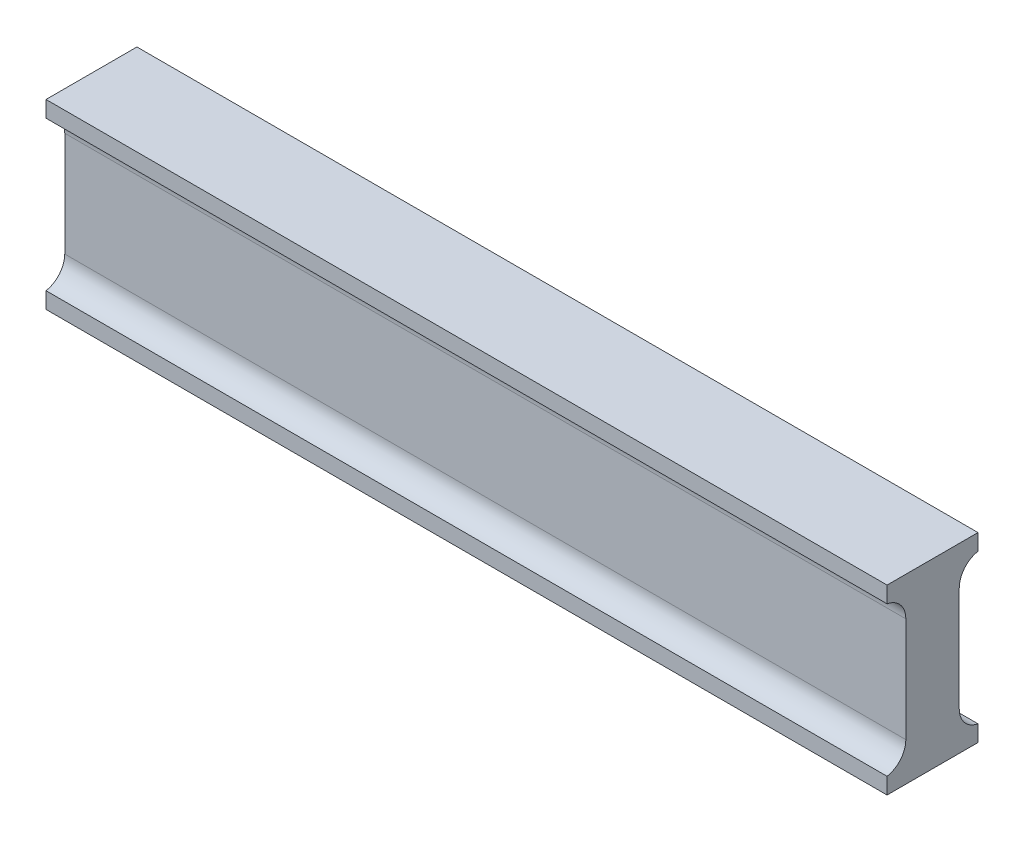
ISO-10303-21;
HEADER;
FILE_DESCRIPTION(('STEP AP214'),'2;1');
FILE_NAME('part.step','',(''),(''),'','','');
FILE_SCHEMA(('AUTOMOTIVE_DESIGN { 1 0 10303 214 1 1 1 1 }'));
ENDSEC;
DATA;
#1=APPLICATION_CONTEXT('core data for automotive mechanical design processes');
#2=APPLICATION_PROTOCOL_DEFINITION('international standard','automotive_design',2000,#1);
#3=PRODUCT_CONTEXT('',#1,'mechanical');
#4=PRODUCT('Part','Part','',(#3));
#5=PRODUCT_RELATED_PRODUCT_CATEGORY('part','',(#4));
#6=PRODUCT_DEFINITION_FORMATION('','',#4);
#7=PRODUCT_DEFINITION_CONTEXT('part definition',#1,'design');
#8=PRODUCT_DEFINITION('design','',#6,#7);
#9=PRODUCT_DEFINITION_SHAPE('','',#8);
#10=(LENGTH_UNIT() NAMED_UNIT(*) SI_UNIT(.MILLI.,.METRE.));
#11=(NAMED_UNIT(*) PLANE_ANGLE_UNIT() SI_UNIT($,.RADIAN.));
#12=(NAMED_UNIT(*) SI_UNIT($,.STERADIAN.) SOLID_ANGLE_UNIT());
#13=UNCERTAINTY_MEASURE_WITH_UNIT(LENGTH_MEASURE(1.E-05),#10,'distance_accuracy_value','');
#14=(GEOMETRIC_REPRESENTATION_CONTEXT(3) GLOBAL_UNCERTAINTY_ASSIGNED_CONTEXT((#13)) GLOBAL_UNIT_ASSIGNED_CONTEXT((#10,
#11,#12)) REPRESENTATION_CONTEXT('',''));
#15=CARTESIAN_POINT('',(0.,0.,0.));
#16=DIRECTION('',(0.,0.,1.));
#17=DIRECTION('',(1.,0.,0.));
#18=AXIS2_PLACEMENT_3D('',#15,#16,#17);
#19=CARTESIAN_POINT('',(0.,0.,20.));
#20=DIRECTION('',(0.,0.,-1.));
#21=DIRECTION('',(-1.,0.,0.));
#22=AXIS2_PLACEMENT_3D('',#19,#20,#21);
#23=PLANE('',#22);
#24=DIRECTION('',(0.,-1.,0.));
#25=VECTOR('',#24,1.);
#26=CARTESIAN_POINT('',(-92.5,-20.,20.));
#27=LINE('',#26,#25);
#28=CARTESIAN_POINT('',(-92.5,20.,20.));
#29=VERTEX_POINT('',#28);
#30=CARTESIAN_POINT('',(-92.5,16.4270123065396,20.));
#31=VERTEX_POINT('',#30);
#32=EDGE_CURVE('E194',#29,#31,#27,.T.);
#33=ORIENTED_EDGE('',*,*,#32,.T.);
#34=DIRECTION('',(1.,0.,0.));
#35=VECTOR('',#34,1.);
#36=CARTESIAN_POINT('',(0.,16.4270123065396,20.));
#37=LINE('',#36,#35);
#38=CARTESIAN_POINT('',(92.5,16.4270123065396,20.));
#39=VERTEX_POINT('',#38);
#40=EDGE_CURVE('E156',#31,#39,#37,.T.);
#41=ORIENTED_EDGE('',*,*,#40,.T.);
#42=DIRECTION('',(0.,1.,0.));
#43=VECTOR('',#42,1.);
#44=CARTESIAN_POINT('',(92.5,-20.,20.));
#45=LINE('',#44,#43);
#46=CARTESIAN_POINT('',(92.5,20.,20.));
#47=VERTEX_POINT('',#46);
#48=EDGE_CURVE('E182',#39,#47,#45,.T.);
#49=ORIENTED_EDGE('',*,*,#48,.T.);
#50=DIRECTION('',(-1.,0.,0.));
#51=VECTOR('',#50,1.);
#52=CARTESIAN_POINT('',(-92.5,20.,20.));
#53=LINE('',#52,#51);
#54=EDGE_CURVE('E197',#47,#29,#53,.T.);
#55=ORIENTED_EDGE('',*,*,#54,.T.);
#56=EDGE_LOOP('',(#33,#41,#49,#55));
#57=FACE_BOUND('',#56,.T.);
#58=ADVANCED_FACE('F37',(#57),#23,.F.);
#59=CARTESIAN_POINT('',(0.,0.,0.));
#60=DIRECTION('',(0.,0.,-1.));
#61=DIRECTION('',(-1.,0.,0.));
#62=AXIS2_PLACEMENT_3D('',#59,#60,#61);
#63=PLANE('',#62);
#64=DIRECTION('',(1.,0.,0.));
#65=VECTOR('',#64,1.);
#66=CARTESIAN_POINT('',(0.,16.4270123065396,0.));
#67=LINE('',#66,#65);
#68=CARTESIAN_POINT('',(-92.5,16.4270123065396,0.));
#69=VERTEX_POINT('',#68);
#70=CARTESIAN_POINT('',(92.5,16.4270123065396,0.));
#71=VERTEX_POINT('',#70);
#72=EDGE_CURVE('E144',#69,#71,#67,.T.);
#73=ORIENTED_EDGE('',*,*,#72,.F.);
#74=DIRECTION('',(0.,-1.,0.));
#75=VECTOR('',#74,1.);
#76=CARTESIAN_POINT('',(-92.5,-20.,0.));
#77=LINE('',#76,#75);
#78=CARTESIAN_POINT('',(-92.5,20.,0.));
#79=VERTEX_POINT('',#78);
#80=EDGE_CURVE('E210',#79,#69,#77,.T.);
#81=ORIENTED_EDGE('',*,*,#80,.F.);
#82=DIRECTION('',(-1.,0.,0.));
#83=VECTOR('',#82,1.);
#84=CARTESIAN_POINT('',(-92.5,20.,0.));
#85=LINE('',#84,#83);
#86=CARTESIAN_POINT('',(92.5,20.,0.));
#87=VERTEX_POINT('',#86);
#88=EDGE_CURVE('E146',#87,#79,#85,.T.);
#89=ORIENTED_EDGE('',*,*,#88,.F.);
#90=DIRECTION('',(0.,1.,0.));
#91=VECTOR('',#90,1.);
#92=CARTESIAN_POINT('',(92.5,-20.,0.));
#93=LINE('',#92,#91);
#94=EDGE_CURVE('E130',#71,#87,#93,.T.);
#95=ORIENTED_EDGE('',*,*,#94,.F.);
#96=EDGE_LOOP('',(#73,#81,#89,#95));
#97=FACE_BOUND('',#96,.T.);
#98=ADVANCED_FACE('F142',(#97),#63,.T.);
#99=CARTESIAN_POINT('',(92.5,-20.,20.));
#100=DIRECTION('',(-1.,0.,0.));
#101=DIRECTION('',(0.,0.,1.));
#102=AXIS2_PLACEMENT_3D('',#99,#100,#101);
#103=PLANE('',#102);
#104=DIRECTION('',(0.,-1.,0.));
#105=VECTOR('',#104,1.);
#106=CARTESIAN_POINT('',(92.5,-16.4270123065396,4.12501901528166));
#107=LINE('',#106,#105);
#108=CARTESIAN_POINT('',(92.5,11.5041667598683,4.12501901528166));
#109=VERTEX_POINT('',#108);
#110=CARTESIAN_POINT('',(92.5,-11.5041667598683,4.12501901528166));
#111=VERTEX_POINT('',#110);
#112=EDGE_CURVE('E133',#109,#111,#107,.T.);
#113=ORIENTED_EDGE('',*,*,#112,.F.);
#114=CARTESIAN_POINT('',(92.5,11.5041667598683,-0.874980984718343));
#115=DIRECTION('',(-1.,0.,0.));
#116=DIRECTION('',(0.,0.,1.));
#117=AXIS2_PLACEMENT_3D('',#114,#115,#116);
#118=CIRCLE('',#117,5.);
#119=EDGE_CURVE('E126',#109,#71,#118,.T.);
#120=ORIENTED_EDGE('',*,*,#119,.T.);
#121=ORIENTED_EDGE('',*,*,#94,.T.);
#122=DIRECTION('',(0.,0.,-1.));
#123=VECTOR('',#122,1.);
#124=CARTESIAN_POINT('',(92.5,20.,20.));
#125=LINE('',#124,#123);
#126=EDGE_CURVE('E159',#47,#87,#125,.T.);
#127=ORIENTED_EDGE('',*,*,#126,.F.);
#128=ORIENTED_EDGE('',*,*,#48,.F.);
#129=CARTESIAN_POINT('',(92.5,11.5041667598683,20.8749809847183));
#130=DIRECTION('',(-1.,0.,0.));
#131=DIRECTION('',(0.,0.,1.));
#132=AXIS2_PLACEMENT_3D('',#129,#130,#131);
#133=CIRCLE('',#132,5.);
#134=CARTESIAN_POINT('',(92.5,11.5041667598683,15.8749809847183));
#135=VERTEX_POINT('',#134);
#136=EDGE_CURVE('E45',#39,#135,#133,.T.);
#137=ORIENTED_EDGE('',*,*,#136,.T.);
#138=DIRECTION('',(0.,1.,0.));
#139=VECTOR('',#138,1.);
#140=CARTESIAN_POINT('',(92.5,-16.4270123065396,15.8749809847183));
#141=LINE('',#140,#139);
#142=CARTESIAN_POINT('',(92.5,-11.5041667598683,15.8749809847183));
#143=VERTEX_POINT('',#142);
#144=EDGE_CURVE('E181',#143,#135,#141,.T.);
#145=ORIENTED_EDGE('',*,*,#144,.F.);
#146=CARTESIAN_POINT('',(92.5,-11.5041667598683,20.8749809847183));
#147=DIRECTION('',(-1.,0.,0.));
#148=DIRECTION('',(0.,0.,1.));
#149=AXIS2_PLACEMENT_3D('',#146,#147,#148);
#150=CIRCLE('',#149,5.);
#151=CARTESIAN_POINT('',(92.5,-16.4270123065396,20.));
#152=VERTEX_POINT('',#151);
#153=EDGE_CURVE('E177',#143,#152,#150,.T.);
#154=ORIENTED_EDGE('',*,*,#153,.T.);
#155=CARTESIAN_POINT('',(92.5,-20.,20.));
#156=VERTEX_POINT('',#155);
#157=EDGE_CURVE('E222',#156,#152,#45,.T.);
#158=ORIENTED_EDGE('',*,*,#157,.F.);
#159=DIRECTION('',(0.,0.,-1.));
#160=VECTOR('',#159,1.);
#161=CARTESIAN_POINT('',(92.5,-20.,20.));
#162=LINE('',#161,#160);
#163=CARTESIAN_POINT('',(92.5,-20.,0.));
#164=VERTEX_POINT('',#163);
#165=EDGE_CURVE('E202',#156,#164,#162,.T.);
#166=ORIENTED_EDGE('',*,*,#165,.T.);
#167=CARTESIAN_POINT('',(92.5,-16.4270123065396,0.));
#168=VERTEX_POINT('',#167);
#169=EDGE_CURVE('E148',#164,#168,#93,.T.);
#170=ORIENTED_EDGE('',*,*,#169,.T.);
#171=CARTESIAN_POINT('',(92.5,-11.5041667598683,-0.874980984718343));
#172=DIRECTION('',(-1.,0.,0.));
#173=DIRECTION('',(0.,0.,1.));
#174=AXIS2_PLACEMENT_3D('',#171,#172,#173);
#175=CIRCLE('',#174,5.);
#176=EDGE_CURVE('E173',#168,#111,#175,.T.);
#177=ORIENTED_EDGE('',*,*,#176,.T.);
#178=EDGE_LOOP('',(#113,#120,#121,#127,#128,#137,#145,#154,#158,#166,#170,#177));
#179=FACE_BOUND('',#178,.T.);
#180=ADVANCED_FACE('F128',(#179),#103,.F.);
#181=CARTESIAN_POINT('',(-92.5,20.,20.));
#182=DIRECTION('',(0.,-1.,0.));
#183=DIRECTION('',(0.,0.,-1.));
#184=AXIS2_PLACEMENT_3D('',#181,#182,#183);
#185=PLANE('',#184);
#186=ORIENTED_EDGE('',*,*,#88,.T.);
#187=DIRECTION('',(0.,0.,-1.));
#188=VECTOR('',#187,1.);
#189=CARTESIAN_POINT('',(-92.5,20.,20.));
#190=LINE('',#189,#188);
#191=EDGE_CURVE('E219',#29,#79,#190,.T.);
#192=ORIENTED_EDGE('',*,*,#191,.F.);
#193=ORIENTED_EDGE('',*,*,#54,.F.);
#194=ORIENTED_EDGE('',*,*,#126,.T.);
#195=EDGE_LOOP('',(#186,#192,#193,#194));
#196=FACE_BOUND('',#195,.T.);
#197=ADVANCED_FACE('F221',(#196),#185,.F.);
#198=CARTESIAN_POINT('',(-92.5,-20.,20.));
#199=DIRECTION('',(1.,0.,0.));
#200=DIRECTION('',(0.,0.,-1.));
#201=AXIS2_PLACEMENT_3D('',#198,#199,#200);
#202=PLANE('',#201);
#203=ORIENTED_EDGE('',*,*,#80,.T.);
#204=CARTESIAN_POINT('',(-92.5,11.5041667598683,-0.874980984718343));
#205=DIRECTION('',(1.,0.,0.));
#206=DIRECTION('',(0.,0.,-1.));
#207=AXIS2_PLACEMENT_3D('',#204,#205,#206);
#208=CIRCLE('',#207,5.);
#209=CARTESIAN_POINT('',(-92.5,11.5041667598683,4.12501901528166));
#210=VERTEX_POINT('',#209);
#211=EDGE_CURVE('E138',#69,#210,#208,.T.);
#212=ORIENTED_EDGE('',*,*,#211,.T.);
#213=DIRECTION('',(0.,-1.,0.));
#214=VECTOR('',#213,1.);
#215=CARTESIAN_POINT('',(-92.5,-16.4270123065396,4.12501901528166));
#216=LINE('',#215,#214);
#217=CARTESIAN_POINT('',(-92.5,-11.5041667598683,4.12501901528166));
#218=VERTEX_POINT('',#217);
#219=EDGE_CURVE('E149',#210,#218,#216,.T.);
#220=ORIENTED_EDGE('',*,*,#219,.T.);
#221=CARTESIAN_POINT('',(-92.5,-11.5041667598683,-0.874980984718343));
#222=DIRECTION('',(1.,0.,0.));
#223=DIRECTION('',(0.,0.,-1.));
#224=AXIS2_PLACEMENT_3D('',#221,#222,#223);
#225=CIRCLE('',#224,5.);
#226=CARTESIAN_POINT('',(-92.5,-16.4270123065396,0.));
#227=VERTEX_POINT('',#226);
#228=EDGE_CURVE('E175',#218,#227,#225,.T.);
#229=ORIENTED_EDGE('',*,*,#228,.T.);
#230=CARTESIAN_POINT('',(-92.5,-20.,0.));
#231=VERTEX_POINT('',#230);
#232=EDGE_CURVE('E209',#227,#231,#77,.T.);
#233=ORIENTED_EDGE('',*,*,#232,.T.);
#234=DIRECTION('',(0.,0.,-1.));
#235=VECTOR('',#234,1.);
#236=CARTESIAN_POINT('',(-92.5,-20.,20.));
#237=LINE('',#236,#235);
#238=CARTESIAN_POINT('',(-92.5,-20.,20.));
#239=VERTEX_POINT('',#238);
#240=EDGE_CURVE('E216',#239,#231,#237,.T.);
#241=ORIENTED_EDGE('',*,*,#240,.F.);
#242=CARTESIAN_POINT('',(-92.5,-16.4270123065396,20.));
#243=VERTEX_POINT('',#242);
#244=EDGE_CURVE('E200',#243,#239,#27,.T.);
#245=ORIENTED_EDGE('',*,*,#244,.F.);
#246=CARTESIAN_POINT('',(-92.5,-11.5041667598683,20.8749809847183));
#247=DIRECTION('',(1.,0.,0.));
#248=DIRECTION('',(0.,0.,-1.));
#249=AXIS2_PLACEMENT_3D('',#246,#247,#248);
#250=CIRCLE('',#249,5.);
#251=CARTESIAN_POINT('',(-92.5,-11.5041667598683,15.8749809847183));
#252=VERTEX_POINT('',#251);
#253=EDGE_CURVE('E59',#243,#252,#250,.T.);
#254=ORIENTED_EDGE('',*,*,#253,.T.);
#255=DIRECTION('',(0.,1.,0.));
#256=VECTOR('',#255,1.);
#257=CARTESIAN_POINT('',(-92.5,-16.4270123065396,15.8749809847183));
#258=LINE('',#257,#256);
#259=CARTESIAN_POINT('',(-92.5,11.5041667598683,15.8749809847183));
#260=VERTEX_POINT('',#259);
#261=EDGE_CURVE('E187',#252,#260,#258,.T.);
#262=ORIENTED_EDGE('',*,*,#261,.T.);
#263=CARTESIAN_POINT('',(-92.5,11.5041667598683,20.8749809847183));
#264=DIRECTION('',(1.,0.,0.));
#265=DIRECTION('',(0.,0.,-1.));
#266=AXIS2_PLACEMENT_3D('',#263,#264,#265);
#267=CIRCLE('',#266,5.);
#268=EDGE_CURVE('E11',#260,#31,#267,.T.);
#269=ORIENTED_EDGE('',*,*,#268,.T.);
#270=ORIENTED_EDGE('',*,*,#32,.F.);
#271=ORIENTED_EDGE('',*,*,#191,.T.);
#272=EDGE_LOOP('',(#203,#212,#220,#229,#233,#241,#245,#254,#262,#269,#270,#271));
#273=FACE_BOUND('',#272,.T.);
#274=ADVANCED_FACE('F192',(#273),#202,.F.);
#275=CARTESIAN_POINT('',(-92.5,-20.,20.));
#276=DIRECTION('',(0.,1.,0.));
#277=DIRECTION('',(0.,0.,1.));
#278=AXIS2_PLACEMENT_3D('',#275,#276,#277);
#279=PLANE('',#278);
#280=DIRECTION('',(1.,0.,0.));
#281=VECTOR('',#280,1.);
#282=CARTESIAN_POINT('',(-92.5,-20.,0.));
#283=LINE('',#282,#281);
#284=EDGE_CURVE('E212',#231,#164,#283,.T.);
#285=ORIENTED_EDGE('',*,*,#284,.T.);
#286=ORIENTED_EDGE('',*,*,#165,.F.);
#287=DIRECTION('',(1.,0.,0.));
#288=VECTOR('',#287,1.);
#289=CARTESIAN_POINT('',(-92.5,-20.,20.));
#290=LINE('',#289,#288);
#291=EDGE_CURVE('E199',#239,#156,#290,.T.);
#292=ORIENTED_EDGE('',*,*,#291,.F.);
#293=ORIENTED_EDGE('',*,*,#240,.T.);
#294=EDGE_LOOP('',(#285,#286,#292,#293));
#295=FACE_BOUND('',#294,.T.);
#296=ADVANCED_FACE('F246',(#295),#279,.F.);
#297=ORIENTED_EDGE('',*,*,#157,.T.);
#298=DIRECTION('',(-1.,0.,0.));
#299=VECTOR('',#298,1.);
#300=CARTESIAN_POINT('',(0.,-16.4270123065396,20.));
#301=LINE('',#300,#299);
#302=EDGE_CURVE('E153',#152,#243,#301,.T.);
#303=ORIENTED_EDGE('',*,*,#302,.T.);
#304=ORIENTED_EDGE('',*,*,#244,.T.);
#305=ORIENTED_EDGE('',*,*,#291,.T.);
#306=EDGE_LOOP('',(#297,#303,#304,#305));
#307=FACE_BOUND('',#306,.T.);
#308=ADVANCED_FACE('F250',(#307),#23,.F.);
#309=DIRECTION('',(-1.,0.,0.));
#310=VECTOR('',#309,1.);
#311=CARTESIAN_POINT('',(0.,-16.4270123065396,0.));
#312=LINE('',#311,#310);
#313=EDGE_CURVE('E154',#168,#227,#312,.T.);
#314=ORIENTED_EDGE('',*,*,#313,.F.);
#315=ORIENTED_EDGE('',*,*,#169,.F.);
#316=ORIENTED_EDGE('',*,*,#284,.F.);
#317=ORIENTED_EDGE('',*,*,#232,.F.);
#318=EDGE_LOOP('',(#314,#315,#316,#317));
#319=FACE_BOUND('',#318,.T.);
#320=ADVANCED_FACE('F241',(#319),#63,.T.);
#321=CARTESIAN_POINT('',(-92.5,-16.4270123065396,4.12501901528166));
#322=DIRECTION('',(0.,0.,1.));
#323=DIRECTION('',(1.,0.,0.));
#324=AXIS2_PLACEMENT_3D('',#321,#322,#323);
#325=PLANE('',#324);
#326=ORIENTED_EDGE('',*,*,#219,.F.);
#327=DIRECTION('',(-1.,0.,0.));
#328=VECTOR('',#327,1.);
#329=CARTESIAN_POINT('',(-92.5,11.5041667598683,4.12501901528166));
#330=LINE('',#329,#328);
#331=EDGE_CURVE('E167',#210,#109,#330,.F.);
#332=ORIENTED_EDGE('',*,*,#331,.T.);
#333=ORIENTED_EDGE('',*,*,#112,.T.);
#334=DIRECTION('',(1.,0.,0.));
#335=VECTOR('',#334,1.);
#336=CARTESIAN_POINT('',(-92.5,-11.5041667598683,4.12501901528166));
#337=LINE('',#336,#335);
#338=EDGE_CURVE('E165',#111,#218,#337,.F.);
#339=ORIENTED_EDGE('',*,*,#338,.T.);
#340=EDGE_LOOP('',(#326,#332,#333,#339));
#341=FACE_BOUND('',#340,.T.);
#342=ADVANCED_FACE('F257',(#341),#325,.F.);
#343=CARTESIAN_POINT('',(-92.5,-16.4270123065396,15.8749809847183));
#344=DIRECTION('',(0.,0.,-1.));
#345=DIRECTION('',(-1.,0.,0.));
#346=AXIS2_PLACEMENT_3D('',#343,#344,#345);
#347=PLANE('',#346);
#348=ORIENTED_EDGE('',*,*,#261,.F.);
#349=DIRECTION('',(1.,0.,0.));
#350=VECTOR('',#349,1.);
#351=CARTESIAN_POINT('',(-92.5,-11.5041667598683,15.8749809847183));
#352=LINE('',#351,#350);
#353=EDGE_CURVE('E139',#252,#143,#352,.T.);
#354=ORIENTED_EDGE('',*,*,#353,.T.);
#355=ORIENTED_EDGE('',*,*,#144,.T.);
#356=DIRECTION('',(-1.,0.,0.));
#357=VECTOR('',#356,1.);
#358=CARTESIAN_POINT('',(-92.5,11.5041667598683,15.8749809847183));
#359=LINE('',#358,#357);
#360=EDGE_CURVE('E52',#135,#260,#359,.T.);
#361=ORIENTED_EDGE('',*,*,#360,.T.);
#362=EDGE_LOOP('',(#348,#354,#355,#361));
#363=FACE_BOUND('',#362,.T.);
#364=ADVANCED_FACE('F185',(#363),#347,.F.);
#365=CARTESIAN_POINT('',(-92.5,11.5041667598683,-0.874980984718343));
#366=DIRECTION('',(-1.,0.,0.));
#367=DIRECTION('',(0.,0.,1.));
#368=AXIS2_PLACEMENT_3D('',#365,#366,#367);
#369=CYLINDRICAL_SURFACE('',#368,5.);
#370=ORIENTED_EDGE('',*,*,#211,.F.);
#371=ORIENTED_EDGE('',*,*,#72,.T.);
#372=ORIENTED_EDGE('',*,*,#119,.F.);
#373=ORIENTED_EDGE('',*,*,#331,.F.);
#374=EDGE_LOOP('',(#370,#371,#372,#373));
#375=FACE_BOUND('',#374,.T.);
#376=ADVANCED_FACE('F152',(#375),#369,.F.);
#377=CARTESIAN_POINT('',(-92.5,-11.5041667598683,-0.874980984718343));
#378=DIRECTION('',(1.,0.,0.));
#379=DIRECTION('',(0.,0.,-1.));
#380=AXIS2_PLACEMENT_3D('',#377,#378,#379);
#381=CYLINDRICAL_SURFACE('',#380,5.);
#382=ORIENTED_EDGE('',*,*,#228,.F.);
#383=ORIENTED_EDGE('',*,*,#338,.F.);
#384=ORIENTED_EDGE('',*,*,#176,.F.);
#385=ORIENTED_EDGE('',*,*,#313,.T.);
#386=EDGE_LOOP('',(#382,#383,#384,#385));
#387=FACE_BOUND('',#386,.T.);
#388=ADVANCED_FACE('F237',(#387),#381,.F.);
#389=CARTESIAN_POINT('',(-92.5,-11.5041667598683,20.8749809847183));
#390=DIRECTION('',(1.,0.,0.));
#391=DIRECTION('',(0.,0.,-1.));
#392=AXIS2_PLACEMENT_3D('',#389,#390,#391);
#393=CYLINDRICAL_SURFACE('',#392,5.);
#394=ORIENTED_EDGE('',*,*,#253,.F.);
#395=ORIENTED_EDGE('',*,*,#302,.F.);
#396=ORIENTED_EDGE('',*,*,#153,.F.);
#397=ORIENTED_EDGE('',*,*,#353,.F.);
#398=EDGE_LOOP('',(#394,#395,#396,#397));
#399=FACE_BOUND('',#398,.T.);
#400=ADVANCED_FACE('F249',(#399),#393,.F.);
#401=CARTESIAN_POINT('',(-92.5,11.5041667598683,20.8749809847183));
#402=DIRECTION('',(-1.,0.,0.));
#403=DIRECTION('',(0.,0.,1.));
#404=AXIS2_PLACEMENT_3D('',#401,#402,#403);
#405=CYLINDRICAL_SURFACE('',#404,5.);
#406=ORIENTED_EDGE('',*,*,#268,.F.);
#407=ORIENTED_EDGE('',*,*,#360,.F.);
#408=ORIENTED_EDGE('',*,*,#136,.F.);
#409=ORIENTED_EDGE('',*,*,#40,.F.);
#410=EDGE_LOOP('',(#406,#407,#408,#409));
#411=FACE_BOUND('',#410,.T.);
#412=ADVANCED_FACE('F39',(#411),#405,.F.);
#413=CLOSED_SHELL('',(#58,#98,#180,#197,#274,#296,#308,#320,#342,#364,#376,#388,#400,#412));
#414=MANIFOLD_SOLID_BREP('B2',#413);
#415=ADVANCED_BREP_SHAPE_REPRESENTATION('',(#18,#414),#14);
#416=SHAPE_DEFINITION_REPRESENTATION(#9,#415);
ENDSEC;
END-ISO-10303-21;
